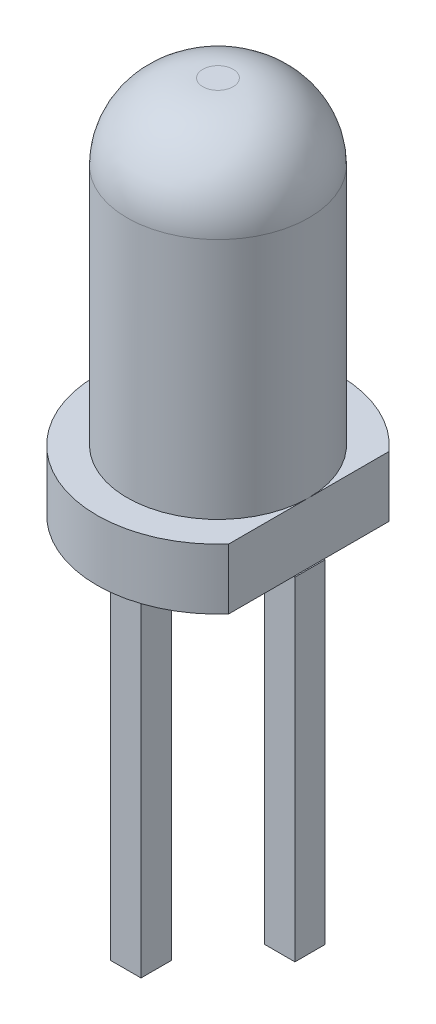
ISO-10303-21;
HEADER;
FILE_DESCRIPTION(('STEP AP214'),'2;1');
FILE_NAME('part.step','',(''),(''),'','','');
FILE_SCHEMA(('AUTOMOTIVE_DESIGN { 1 0 10303 214 1 1 1 1 }'));
ENDSEC;
DATA;
#1=APPLICATION_CONTEXT('core data for automotive mechanical design processes');
#2=APPLICATION_PROTOCOL_DEFINITION('international standard','automotive_design',2000,#1);
#3=PRODUCT_CONTEXT('',#1,'mechanical');
#4=PRODUCT('Part','Part','',(#3));
#5=PRODUCT_RELATED_PRODUCT_CATEGORY('part','',(#4));
#6=PRODUCT_DEFINITION_FORMATION('','',#4);
#7=PRODUCT_DEFINITION_CONTEXT('part definition',#1,'design');
#8=PRODUCT_DEFINITION('design','',#6,#7);
#9=PRODUCT_DEFINITION_SHAPE('','',#8);
#10=(LENGTH_UNIT() NAMED_UNIT(*) SI_UNIT(.MILLI.,.METRE.));
#11=(NAMED_UNIT(*) PLANE_ANGLE_UNIT() SI_UNIT($,.RADIAN.));
#12=(NAMED_UNIT(*) SI_UNIT($,.STERADIAN.) SOLID_ANGLE_UNIT());
#13=UNCERTAINTY_MEASURE_WITH_UNIT(LENGTH_MEASURE(1.E-05),#10,'distance_accuracy_value','');
#14=(GEOMETRIC_REPRESENTATION_CONTEXT(3) GLOBAL_UNCERTAINTY_ASSIGNED_CONTEXT((#13)) GLOBAL_UNIT_ASSIGNED_CONTEXT((#10,
#11,#12)) REPRESENTATION_CONTEXT('',''));
#15=CARTESIAN_POINT('',(0.,0.,0.));
#16=DIRECTION('',(0.,0.,1.));
#17=DIRECTION('',(1.,0.,0.));
#18=AXIS2_PLACEMENT_3D('',#15,#16,#17);
#19=CARTESIAN_POINT('',(1.02017272281868,-7.,-0.25));
#20=DIRECTION('',(1.,0.,0.));
#21=DIRECTION('',(0.,0.,-1.));
#22=AXIS2_PLACEMENT_3D('',#19,#20,#21);
#23=PLANE('',#22);
#24=DIRECTION('',(0.,0.,-1.));
#25=VECTOR('',#24,1.);
#26=CARTESIAN_POINT('',(1.02017272281868,-5.5,0.25));
#27=LINE('',#26,#25);
#28=CARTESIAN_POINT('',(1.02017272281868,-5.5,0.25));
#29=VERTEX_POINT('',#28);
#30=CARTESIAN_POINT('',(1.02017272281868,-5.5,-0.25));
#31=VERTEX_POINT('',#30);
#32=EDGE_CURVE('E346',#29,#31,#27,.T.);
#33=ORIENTED_EDGE('',*,*,#32,.F.);
#34=DIRECTION('',(0.,1.,0.));
#35=VECTOR('',#34,1.);
#36=CARTESIAN_POINT('',(1.02017272281868,-7.,0.25));
#37=LINE('',#36,#35);
#38=CARTESIAN_POINT('',(1.02017272281868,0.,0.25));
#39=VERTEX_POINT('',#38);
#40=EDGE_CURVE('E345',#29,#39,#37,.T.);
#41=ORIENTED_EDGE('',*,*,#40,.T.);
#42=DIRECTION('',(0.,0.,-1.));
#43=VECTOR('',#42,1.);
#44=CARTESIAN_POINT('',(1.02017272281868,0.,-0.25));
#45=LINE('',#44,#43);
#46=CARTESIAN_POINT('',(1.02017272281868,0.,-0.25));
#47=VERTEX_POINT('',#46);
#48=EDGE_CURVE('E417',#39,#47,#45,.T.);
#49=ORIENTED_EDGE('',*,*,#48,.T.);
#50=DIRECTION('',(0.,1.,0.));
#51=VECTOR('',#50,1.);
#52=CARTESIAN_POINT('',(1.02017272281868,-7.,-0.25));
#53=LINE('',#52,#51);
#54=EDGE_CURVE('E354',#31,#47,#53,.T.);
#55=ORIENTED_EDGE('',*,*,#54,.F.);
#56=EDGE_LOOP('',(#33,#41,#49,#55));
#57=FACE_BOUND('',#56,.T.);
#58=ADVANCED_FACE('F37',(#57),#23,.F.);
#59=CARTESIAN_POINT('',(1.02017272281868,-7.,-0.25));
#60=DIRECTION('',(0.,0.,1.));
#61=DIRECTION('',(1.,0.,0.));
#62=AXIS2_PLACEMENT_3D('',#59,#60,#61);
#63=PLANE('',#62);
#64=DIRECTION('',(1.,0.,0.));
#65=VECTOR('',#64,1.);
#66=CARTESIAN_POINT('',(1.02017272281868,-5.5,-0.25));
#67=LINE('',#66,#65);
#68=CARTESIAN_POINT('',(1.52017272281868,-5.5,-0.25));
#69=VERTEX_POINT('',#68);
#70=EDGE_CURVE('E414',#31,#69,#67,.T.);
#71=ORIENTED_EDGE('',*,*,#70,.F.);
#72=ORIENTED_EDGE('',*,*,#54,.T.);
#73=DIRECTION('',(1.,0.,0.));
#74=VECTOR('',#73,1.);
#75=CARTESIAN_POINT('',(1.02017272281868,0.,-0.25));
#76=LINE('',#75,#74);
#77=CARTESIAN_POINT('',(1.5,0.,-0.25));
#78=VERTEX_POINT('',#77);
#79=EDGE_CURVE('E420',#47,#78,#76,.T.);
#80=ORIENTED_EDGE('',*,*,#79,.T.);
#81=DIRECTION('',(-1.,0.,0.));
#82=VECTOR('',#81,1.);
#83=CARTESIAN_POINT('',(1.02017272281868,0.,-0.25));
#84=LINE('',#83,#82);
#85=CARTESIAN_POINT('',(1.52017272281868,0.,-0.25));
#86=VERTEX_POINT('',#85);
#87=EDGE_CURVE('E347',#86,#78,#84,.T.);
#88=ORIENTED_EDGE('',*,*,#87,.F.);
#89=DIRECTION('',(0.,1.,0.));
#90=VECTOR('',#89,1.);
#91=CARTESIAN_POINT('',(1.52017272281868,-7.,-0.25));
#92=LINE('',#91,#90);
#93=EDGE_CURVE('E352',#69,#86,#92,.T.);
#94=ORIENTED_EDGE('',*,*,#93,.F.);
#95=EDGE_LOOP('',(#71,#72,#80,#88,#94));
#96=FACE_BOUND('',#95,.T.);
#97=ADVANCED_FACE('F164',(#96),#63,.F.);
#98=CARTESIAN_POINT('',(1.52017272281868,-7.,-0.25));
#99=DIRECTION('',(-1.,0.,0.));
#100=DIRECTION('',(0.,0.,1.));
#101=AXIS2_PLACEMENT_3D('',#98,#99,#100);
#102=PLANE('',#101);
#103=DIRECTION('',(0.,0.,1.));
#104=VECTOR('',#103,1.);
#105=CARTESIAN_POINT('',(1.52017272281868,-5.5,-0.25));
#106=LINE('',#105,#104);
#107=CARTESIAN_POINT('',(1.52017272281868,-5.5,0.25));
#108=VERTEX_POINT('',#107);
#109=EDGE_CURVE('E60',#69,#108,#106,.T.);
#110=ORIENTED_EDGE('',*,*,#109,.F.);
#111=ORIENTED_EDGE('',*,*,#93,.T.);
#112=DIRECTION('',(0.,0.,1.));
#113=VECTOR('',#112,1.);
#114=CARTESIAN_POINT('',(1.52017272281868,0.,-0.25));
#115=LINE('',#114,#113);
#116=CARTESIAN_POINT('',(1.52017272281868,0.,0.25));
#117=VERTEX_POINT('',#116);
#118=EDGE_CURVE('E351',#86,#117,#115,.T.);
#119=ORIENTED_EDGE('',*,*,#118,.T.);
#120=DIRECTION('',(0.,1.,0.));
#121=VECTOR('',#120,1.);
#122=CARTESIAN_POINT('',(1.52017272281868,-7.,0.25));
#123=LINE('',#122,#121);
#124=EDGE_CURVE('E342',#108,#117,#123,.T.);
#125=ORIENTED_EDGE('',*,*,#124,.F.);
#126=EDGE_LOOP('',(#110,#111,#119,#125));
#127=FACE_BOUND('',#126,.T.);
#128=ADVANCED_FACE('F170',(#127),#102,.F.);
#129=CARTESIAN_POINT('',(1.02017272281868,-7.,0.25));
#130=DIRECTION('',(0.,0.,-1.));
#131=DIRECTION('',(-1.,0.,0.));
#132=AXIS2_PLACEMENT_3D('',#129,#130,#131);
#133=PLANE('',#132);
#134=DIRECTION('',(-1.,0.,0.));
#135=VECTOR('',#134,1.);
#136=CARTESIAN_POINT('',(1.52017272281868,-5.5,0.25));
#137=LINE('',#136,#135);
#138=EDGE_CURVE('E339',#108,#29,#137,.T.);
#139=ORIENTED_EDGE('',*,*,#138,.F.);
#140=ORIENTED_EDGE('',*,*,#124,.T.);
#141=DIRECTION('',(-1.,0.,0.));
#142=VECTOR('',#141,1.);
#143=CARTESIAN_POINT('',(1.02017272281868,0.,0.25));
#144=LINE('',#143,#142);
#145=CARTESIAN_POINT('',(1.5,0.,0.25));
#146=VERTEX_POINT('',#145);
#147=EDGE_CURVE('E356',#117,#146,#144,.T.);
#148=ORIENTED_EDGE('',*,*,#147,.T.);
#149=EDGE_CURVE('E408',#146,#39,#144,.T.);
#150=ORIENTED_EDGE('',*,*,#149,.T.);
#151=ORIENTED_EDGE('',*,*,#40,.F.);
#152=EDGE_LOOP('',(#139,#140,#148,#150,#151));
#153=FACE_BOUND('',#152,.T.);
#154=ADVANCED_FACE('F207',(#153),#133,.F.);
#155=CARTESIAN_POINT('',(0.,0.,0.));
#156=DIRECTION('',(0.,1.,0.));
#157=DIRECTION('',(0.,0.,1.));
#158=AXIS2_PLACEMENT_3D('',#155,#156,#157);
#159=PLANE('',#158);
#160=DIRECTION('',(0.,0.,-1.));
#161=VECTOR('',#160,1.);
#162=CARTESIAN_POINT('',(-1.52014292306889,0.,-0.25));
#163=LINE('',#162,#161);
#164=CARTESIAN_POINT('',(-1.52014292306889,0.,0.25));
#165=VERTEX_POINT('',#164);
#166=CARTESIAN_POINT('',(-1.52014292306889,0.,-0.25));
#167=VERTEX_POINT('',#166);
#168=EDGE_CURVE('E361',#165,#167,#163,.T.);
#169=ORIENTED_EDGE('',*,*,#168,.F.);
#170=DIRECTION('',(-1.,0.,0.));
#171=VECTOR('',#170,1.);
#172=CARTESIAN_POINT('',(-1.52014292306889,0.,0.25));
#173=LINE('',#172,#171);
#174=CARTESIAN_POINT('',(-1.02014292306889,0.,0.25));
#175=VERTEX_POINT('',#174);
#176=EDGE_CURVE('E366',#175,#165,#173,.T.);
#177=ORIENTED_EDGE('',*,*,#176,.F.);
#178=DIRECTION('',(0.,0.,1.));
#179=VECTOR('',#178,1.);
#180=CARTESIAN_POINT('',(-1.02014292306889,0.,-0.25));
#181=LINE('',#180,#179);
#182=CARTESIAN_POINT('',(-1.02014292306889,0.,-0.25));
#183=VERTEX_POINT('',#182);
#184=EDGE_CURVE('E378',#183,#175,#181,.T.);
#185=ORIENTED_EDGE('',*,*,#184,.F.);
#186=DIRECTION('',(1.,0.,0.));
#187=VECTOR('',#186,1.);
#188=CARTESIAN_POINT('',(-1.52014292306889,0.,-0.25));
#189=LINE('',#188,#187);
#190=EDGE_CURVE('E375',#167,#183,#189,.T.);
#191=ORIENTED_EDGE('',*,*,#190,.F.);
#192=EDGE_LOOP('',(#169,#177,#185,#191));
#193=FACE_BOUND('',#192,.T.);
#194=CARTESIAN_POINT('',(0.,0.,0.));
#195=DIRECTION('',(0.,1.,0.));
#196=DIRECTION('',(0.,0.,1.));
#197=AXIS2_PLACEMENT_3D('',#194,#195,#196);
#198=CIRCLE('',#197,2.);
#199=CARTESIAN_POINT('',(1.5,0.,-1.3228756555323));
#200=VERTEX_POINT('',#199);
#201=CARTESIAN_POINT('',(1.5,0.,1.32287565553229));
#202=VERTEX_POINT('',#201);
#203=EDGE_CURVE('E143',#200,#202,#198,.T.);
#204=ORIENTED_EDGE('',*,*,#203,.F.);
#205=DIRECTION('',(0.,0.,-1.));
#206=VECTOR('',#205,1.);
#207=CARTESIAN_POINT('',(1.5,0.,-2.73044739038099));
#208=LINE('',#207,#206);
#209=EDGE_CURVE('E127',#78,#200,#208,.T.);
#210=ORIENTED_EDGE('',*,*,#209,.F.);
#211=ORIENTED_EDGE('',*,*,#79,.F.);
#212=ORIENTED_EDGE('',*,*,#48,.F.);
#213=ORIENTED_EDGE('',*,*,#149,.F.);
#214=EDGE_CURVE('E406',#202,#146,#208,.T.);
#215=ORIENTED_EDGE('',*,*,#214,.F.);
#216=EDGE_LOOP('',(#204,#210,#211,#212,#213,#215));
#217=FACE_BOUND('',#216,.T.);
#218=ADVANCED_FACE('F205',(#193,#217),#159,.F.);
#219=CARTESIAN_POINT('',(0.,1.,0.));
#220=DIRECTION('',(0.,1.,0.));
#221=DIRECTION('',(0.,0.,1.));
#222=AXIS2_PLACEMENT_3D('',#219,#220,#221);
#223=PLANE('',#222);
#224=DIRECTION('',(0.,0.,1.));
#225=VECTOR('',#224,1.);
#226=CARTESIAN_POINT('',(1.5,1.,-2.73044739038099));
#227=LINE('',#226,#225);
#228=CARTESIAN_POINT('',(1.5,1.,-1.3228756555323));
#229=VERTEX_POINT('',#228);
#230=CARTESIAN_POINT('',(1.5,1.,0.));
#231=VERTEX_POINT('',#230);
#232=EDGE_CURVE('E124',#229,#231,#227,.T.);
#233=ORIENTED_EDGE('',*,*,#232,.F.);
#234=CARTESIAN_POINT('',(0.,1.,0.));
#235=DIRECTION('',(0.,1.,0.));
#236=DIRECTION('',(0.,0.,1.));
#237=AXIS2_PLACEMENT_3D('',#234,#235,#236);
#238=CIRCLE('',#237,2.);
#239=CARTESIAN_POINT('',(1.5,1.,1.32287565553229));
#240=VERTEX_POINT('',#239);
#241=EDGE_CURVE('E138',#229,#240,#238,.T.);
#242=ORIENTED_EDGE('',*,*,#241,.T.);
#243=EDGE_CURVE('E52',#231,#240,#227,.T.);
#244=ORIENTED_EDGE('',*,*,#243,.F.);
#245=CARTESIAN_POINT('',(0.,1.,0.));
#246=DIRECTION('',(0.,1.,0.));
#247=DIRECTION('',(0.,0.,1.));
#248=AXIS2_PLACEMENT_3D('',#245,#246,#247);
#249=CIRCLE('',#248,1.5);
#250=EDGE_CURVE('E140',#231,#231,#249,.T.);
#251=ORIENTED_EDGE('',*,*,#250,.F.);
#252=EDGE_LOOP('',(#233,#242,#244,#251));
#253=FACE_BOUND('',#252,.T.);
#254=ADVANCED_FACE('F137',(#253),#223,.T.);
#255=CARTESIAN_POINT('',(0.,1.,0.));
#256=DIRECTION('',(0.,-1.,0.));
#257=DIRECTION('',(0.,0.,-1.));
#258=AXIS2_PLACEMENT_3D('',#255,#256,#257);
#259=CYLINDRICAL_SURFACE('',#258,2.);
#260=ORIENTED_EDGE('',*,*,#241,.F.);
#261=DIRECTION('',(0.,-1.,0.));
#262=VECTOR('',#261,1.);
#263=CARTESIAN_POINT('',(1.5,1.,-1.3228756555323));
#264=LINE('',#263,#262);
#265=EDGE_CURVE('E121',#229,#200,#264,.T.);
#266=ORIENTED_EDGE('',*,*,#265,.T.);
#267=ORIENTED_EDGE('',*,*,#203,.T.);
#268=DIRECTION('',(0.,-1.,0.));
#269=VECTOR('',#268,1.);
#270=CARTESIAN_POINT('',(1.5,1.,1.32287565553229));
#271=LINE('',#270,#269);
#272=EDGE_CURVE('E132',#202,#240,#271,.F.);
#273=ORIENTED_EDGE('',*,*,#272,.T.);
#274=EDGE_LOOP('',(#260,#266,#267,#273));
#275=FACE_BOUND('',#274,.T.);
#276=ADVANCED_FACE('F142',(#275),#259,.T.);
#277=CARTESIAN_POINT('',(0.,6.25,0.));
#278=DIRECTION('',(0.,-1.,0.));
#279=DIRECTION('',(0.,0.,-1.));
#280=AXIS2_PLACEMENT_3D('',#277,#278,#279);
#281=CYLINDRICAL_SURFACE('',#280,1.5);
#282=CARTESIAN_POINT('',(0.,5.,0.));
#283=DIRECTION('',(0.,1.,0.));
#284=DIRECTION('',(0.,0.,1.));
#285=AXIS2_PLACEMENT_3D('',#282,#283,#284);
#286=CIRCLE('',#285,1.5);
#287=CARTESIAN_POINT('',(0.,5.,1.5));
#288=VERTEX_POINT('',#287);
#289=EDGE_CURVE('E12',#288,#288,#286,.F.);
#290=ORIENTED_EDGE('',*,*,#289,.T.);
#291=EDGE_LOOP('',(#290));
#292=FACE_BOUND('',#291,.T.);
#293=ORIENTED_EDGE('',*,*,#250,.T.);
#294=EDGE_LOOP('',(#293));
#295=FACE_BOUND('',#294,.T.);
#296=ADVANCED_FACE('F199',(#292,#295),#281,.T.);
#297=CARTESIAN_POINT('',(0.,6.25,0.));
#298=DIRECTION('',(0.,1.,0.));
#299=DIRECTION('',(0.,0.,1.));
#300=AXIS2_PLACEMENT_3D('',#297,#298,#299);
#301=PLANE('',#300);
#302=CARTESIAN_POINT('',(0.,6.25,0.));
#303=DIRECTION('',(0.,1.,0.));
#304=DIRECTION('',(0.,0.,1.));
#305=AXIS2_PLACEMENT_3D('',#302,#303,#304);
#306=CIRCLE('',#305,0.25);
#307=CARTESIAN_POINT('',(0.,6.25,0.25));
#308=VERTEX_POINT('',#307);
#309=EDGE_CURVE('E45',#308,#308,#306,.T.);
#310=ORIENTED_EDGE('',*,*,#309,.T.);
#311=EDGE_LOOP('',(#310));
#312=FACE_BOUND('',#311,.T.);
#313=ADVANCED_FACE('F152',(#312),#301,.T.);
#314=CARTESIAN_POINT('',(-1.52014292306889,-7.,-0.25));
#315=DIRECTION('',(1.,0.,0.));
#316=DIRECTION('',(0.,0.,-1.));
#317=AXIS2_PLACEMENT_3D('',#314,#315,#316);
#318=PLANE('',#317);
#319=ORIENTED_EDGE('',*,*,#168,.T.);
#320=DIRECTION('',(0.,1.,0.));
#321=VECTOR('',#320,1.);
#322=CARTESIAN_POINT('',(-1.52014292306889,-7.,-0.25));
#323=LINE('',#322,#321);
#324=CARTESIAN_POINT('',(-1.52014292306889,-7.,-0.25));
#325=VERTEX_POINT('',#324);
#326=EDGE_CURVE('E390',#325,#167,#323,.T.);
#327=ORIENTED_EDGE('',*,*,#326,.F.);
#328=DIRECTION('',(0.,0.,-1.));
#329=VECTOR('',#328,1.);
#330=CARTESIAN_POINT('',(-1.52014292306889,-7.,-0.25));
#331=LINE('',#330,#329);
#332=CARTESIAN_POINT('',(-1.52014292306889,-7.,0.25));
#333=VERTEX_POINT('',#332);
#334=EDGE_CURVE('E362',#333,#325,#331,.T.);
#335=ORIENTED_EDGE('',*,*,#334,.F.);
#336=DIRECTION('',(0.,1.,0.));
#337=VECTOR('',#336,1.);
#338=CARTESIAN_POINT('',(-1.52014292306889,-7.,0.25));
#339=LINE('',#338,#337);
#340=EDGE_CURVE('E372',#333,#165,#339,.T.);
#341=ORIENTED_EDGE('',*,*,#340,.T.);
#342=EDGE_LOOP('',(#319,#327,#335,#341));
#343=FACE_BOUND('',#342,.T.);
#344=ADVANCED_FACE('F192',(#343),#318,.F.);
#345=CARTESIAN_POINT('',(-1.52014292306889,-7.,-0.25));
#346=DIRECTION('',(0.,0.,1.));
#347=DIRECTION('',(1.,0.,0.));
#348=AXIS2_PLACEMENT_3D('',#345,#346,#347);
#349=PLANE('',#348);
#350=ORIENTED_EDGE('',*,*,#190,.T.);
#351=DIRECTION('',(0.,1.,0.));
#352=VECTOR('',#351,1.);
#353=CARTESIAN_POINT('',(-1.02014292306889,-7.,-0.25));
#354=LINE('',#353,#352);
#355=CARTESIAN_POINT('',(-1.02014292306889,-7.,-0.25));
#356=VERTEX_POINT('',#355);
#357=EDGE_CURVE('E388',#356,#183,#354,.T.);
#358=ORIENTED_EDGE('',*,*,#357,.F.);
#359=DIRECTION('',(1.,0.,0.));
#360=VECTOR('',#359,1.);
#361=CARTESIAN_POINT('',(-1.52014292306889,-7.,-0.25));
#362=LINE('',#361,#360);
#363=EDGE_CURVE('E365',#325,#356,#362,.T.);
#364=ORIENTED_EDGE('',*,*,#363,.F.);
#365=ORIENTED_EDGE('',*,*,#326,.T.);
#366=EDGE_LOOP('',(#350,#358,#364,#365));
#367=FACE_BOUND('',#366,.T.);
#368=ADVANCED_FACE('F188',(#367),#349,.F.);
#369=CARTESIAN_POINT('',(-1.02014292306889,-7.,-0.25));
#370=DIRECTION('',(-1.,0.,0.));
#371=DIRECTION('',(0.,0.,1.));
#372=AXIS2_PLACEMENT_3D('',#369,#370,#371);
#373=PLANE('',#372);
#374=ORIENTED_EDGE('',*,*,#184,.T.);
#375=DIRECTION('',(0.,1.,0.));
#376=VECTOR('',#375,1.);
#377=CARTESIAN_POINT('',(-1.02014292306889,-7.,0.25));
#378=LINE('',#377,#376);
#379=CARTESIAN_POINT('',(-1.02014292306889,-7.,0.25));
#380=VERTEX_POINT('',#379);
#381=EDGE_CURVE('E385',#380,#175,#378,.T.);
#382=ORIENTED_EDGE('',*,*,#381,.F.);
#383=DIRECTION('',(0.,0.,1.));
#384=VECTOR('',#383,1.);
#385=CARTESIAN_POINT('',(-1.02014292306889,-7.,-0.25));
#386=LINE('',#385,#384);
#387=EDGE_CURVE('E368',#356,#380,#386,.T.);
#388=ORIENTED_EDGE('',*,*,#387,.F.);
#389=ORIENTED_EDGE('',*,*,#357,.T.);
#390=EDGE_LOOP('',(#374,#382,#388,#389));
#391=FACE_BOUND('',#390,.T.);
#392=ADVANCED_FACE('F184',(#391),#373,.F.);
#393=CARTESIAN_POINT('',(-1.52014292306889,-7.,0.25));
#394=DIRECTION('',(0.,0.,-1.));
#395=DIRECTION('',(-1.,0.,0.));
#396=AXIS2_PLACEMENT_3D('',#393,#394,#395);
#397=PLANE('',#396);
#398=ORIENTED_EDGE('',*,*,#176,.T.);
#399=ORIENTED_EDGE('',*,*,#340,.F.);
#400=DIRECTION('',(-1.,0.,0.));
#401=VECTOR('',#400,1.);
#402=CARTESIAN_POINT('',(-1.52014292306889,-7.,0.25));
#403=LINE('',#402,#401);
#404=EDGE_CURVE('E370',#380,#333,#403,.T.);
#405=ORIENTED_EDGE('',*,*,#404,.F.);
#406=ORIENTED_EDGE('',*,*,#381,.T.);
#407=EDGE_LOOP('',(#398,#399,#405,#406));
#408=FACE_BOUND('',#407,.T.);
#409=ADVANCED_FACE('F180',(#408),#397,.F.);
#410=CARTESIAN_POINT('',(-1.52014292306889,-7.,0.25));
#411=DIRECTION('',(0.,1.,0.));
#412=DIRECTION('',(0.,0.,1.));
#413=AXIS2_PLACEMENT_3D('',#410,#411,#412);
#414=PLANE('',#413);
#415=ORIENTED_EDGE('',*,*,#334,.T.);
#416=ORIENTED_EDGE('',*,*,#363,.T.);
#417=ORIENTED_EDGE('',*,*,#387,.T.);
#418=ORIENTED_EDGE('',*,*,#404,.T.);
#419=EDGE_LOOP('',(#415,#416,#417,#418));
#420=FACE_BOUND('',#419,.T.);
#421=ADVANCED_FACE('F176',(#420),#414,.F.);
#422=CARTESIAN_POINT('',(1.02017272281868,-5.5,0.25));
#423=DIRECTION('',(0.,-1.,0.));
#424=DIRECTION('',(0.,0.,-1.));
#425=AXIS2_PLACEMENT_3D('',#422,#423,#424);
#426=PLANE('',#425);
#427=ORIENTED_EDGE('',*,*,#138,.T.);
#428=ORIENTED_EDGE('',*,*,#32,.T.);
#429=ORIENTED_EDGE('',*,*,#70,.T.);
#430=ORIENTED_EDGE('',*,*,#109,.T.);
#431=EDGE_LOOP('',(#427,#428,#429,#430));
#432=FACE_BOUND('',#431,.T.);
#433=ADVANCED_FACE('F179',(#432),#426,.T.);
#434=CARTESIAN_POINT('',(1.5,-4.60977222864644,-2.73044739038099));
#435=DIRECTION('',(-1.,0.,0.));
#436=DIRECTION('',(0.,0.,1.));
#437=AXIS2_PLACEMENT_3D('',#434,#435,#436);
#438=PLANE('',#437);
#439=ORIENTED_EDGE('',*,*,#232,.T.);
#440=ORIENTED_EDGE('',*,*,#243,.T.);
#441=ORIENTED_EDGE('',*,*,#272,.F.);
#442=ORIENTED_EDGE('',*,*,#214,.T.);
#443=EDGE_CURVE('E409',#146,#78,#208,.T.);
#444=ORIENTED_EDGE('',*,*,#443,.T.);
#445=ORIENTED_EDGE('',*,*,#209,.T.);
#446=ORIENTED_EDGE('',*,*,#265,.F.);
#447=EDGE_LOOP('',(#439,#440,#441,#442,#444,#445,#446));
#448=FACE_BOUND('',#447,.T.);
#449=ADVANCED_FACE('F123',(#448),#438,.F.);
#450=CARTESIAN_POINT('',(0.,0.,0.));
#451=DIRECTION('',(0.,1.,0.));
#452=DIRECTION('',(0.,0.,1.));
#453=AXIS2_PLACEMENT_3D('',#450,#451,#452);
#454=PLANE('',#453);
#455=ORIENTED_EDGE('',*,*,#87,.T.);
#456=ORIENTED_EDGE('',*,*,#443,.F.);
#457=ORIENTED_EDGE('',*,*,#147,.F.);
#458=ORIENTED_EDGE('',*,*,#118,.F.);
#459=EDGE_LOOP('',(#455,#456,#457,#458));
#460=FACE_BOUND('',#459,.T.);
#461=ADVANCED_FACE('F155',(#460),#454,.T.);
#462=CARTESIAN_POINT('',(0.,5.,0.));
#463=DIRECTION('',(0.,1.,0.));
#464=DIRECTION('',(0.,0.,1.));
#465=AXIS2_PLACEMENT_3D('',#462,#463,#464);
#466=DEGENERATE_TOROIDAL_SURFACE('',#465,0.25,1.25,.T.);
#467=ORIENTED_EDGE('',*,*,#289,.F.);
#468=EDGE_LOOP('',(#467));
#469=FACE_BOUND('',#468,.T.);
#470=ORIENTED_EDGE('',*,*,#309,.F.);
#471=EDGE_LOOP('',(#470));
#472=FACE_BOUND('',#471,.T.);
#473=ADVANCED_FACE('F39',(#469,#472),#466,.T.);
#474=CLOSED_SHELL('',(#58,#97,#128,#154,#218,#254,#276,#296,#313,#344,#368,#392,#409,#421,#433,
#449,#461,#473));
#475=MANIFOLD_SOLID_BREP('B2',#474);
#476=ADVANCED_BREP_SHAPE_REPRESENTATION('',(#18,#475),#14);
#477=SHAPE_DEFINITION_REPRESENTATION(#9,#476);
ENDSEC;
END-ISO-10303-21;
